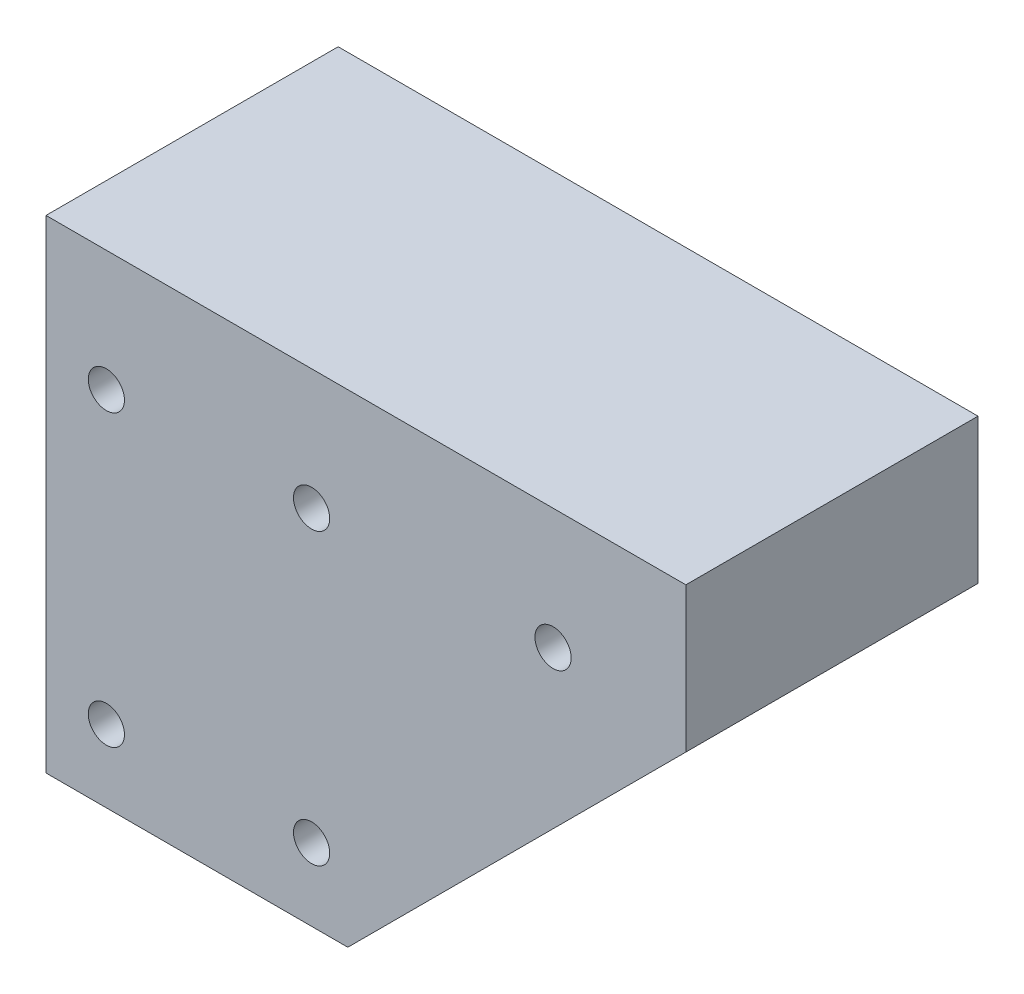
ISO-10303-21;
HEADER;
FILE_DESCRIPTION(('STEP AP214'),'2;1');
FILE_NAME('part.step','',(''),(''),'','','');
FILE_SCHEMA(('AUTOMOTIVE_DESIGN { 1 0 10303 214 1 1 1 1 }'));
ENDSEC;
DATA;
#1=APPLICATION_CONTEXT('core data for automotive mechanical design processes');
#2=APPLICATION_PROTOCOL_DEFINITION('international standard','automotive_design',2000,#1);
#3=PRODUCT_CONTEXT('',#1,'mechanical');
#4=PRODUCT('Part','Part','',(#3));
#5=PRODUCT_RELATED_PRODUCT_CATEGORY('part','',(#4));
#6=PRODUCT_DEFINITION_FORMATION('','',#4);
#7=PRODUCT_DEFINITION_CONTEXT('part definition',#1,'design');
#8=PRODUCT_DEFINITION('design','',#6,#7);
#9=PRODUCT_DEFINITION_SHAPE('','',#8);
#10=(LENGTH_UNIT() NAMED_UNIT(*) SI_UNIT(.MILLI.,.METRE.));
#11=(NAMED_UNIT(*) PLANE_ANGLE_UNIT() SI_UNIT($,.RADIAN.));
#12=(NAMED_UNIT(*) SI_UNIT($,.STERADIAN.) SOLID_ANGLE_UNIT());
#13=UNCERTAINTY_MEASURE_WITH_UNIT(LENGTH_MEASURE(1.E-05),#10,'distance_accuracy_value','');
#14=(GEOMETRIC_REPRESENTATION_CONTEXT(3) GLOBAL_UNCERTAINTY_ASSIGNED_CONTEXT((#13)) GLOBAL_UNIT_ASSIGNED_CONTEXT((#10,
#11,#12)) REPRESENTATION_CONTEXT('',''));
#15=CARTESIAN_POINT('',(0.,0.,0.));
#16=DIRECTION('',(0.,0.,1.));
#17=DIRECTION('',(1.,0.,0.));
#18=AXIS2_PLACEMENT_3D('',#15,#16,#17);
#19=CARTESIAN_POINT('',(53.,0.,24.2));
#20=DIRECTION('',(-1.,0.,0.));
#21=DIRECTION('',(0.,0.,1.));
#22=AXIS2_PLACEMENT_3D('',#19,#20,#21);
#23=PLANE('',#22);
#24=DIRECTION('',(0.,0.,1.));
#25=VECTOR('',#24,1.);
#26=CARTESIAN_POINT('',(53.,28.,0.));
#27=LINE('',#26,#25);
#28=CARTESIAN_POINT('',(53.,28.,0.));
#29=VERTEX_POINT('',#28);
#30=CARTESIAN_POINT('',(53.,28.,24.2));
#31=VERTEX_POINT('',#30);
#32=EDGE_CURVE('E97',#29,#31,#27,.T.);
#33=ORIENTED_EDGE('',*,*,#32,.F.);
#34=DIRECTION('',(0.,1.,0.));
#35=VECTOR('',#34,1.);
#36=CARTESIAN_POINT('',(53.,0.,0.));
#37=LINE('',#36,#35);
#38=CARTESIAN_POINT('',(53.,40.,0.));
#39=VERTEX_POINT('',#38);
#40=EDGE_CURVE('E110',#29,#39,#37,.T.);
#41=ORIENTED_EDGE('',*,*,#40,.T.);
#42=DIRECTION('',(0.,0.,-1.));
#43=VECTOR('',#42,1.);
#44=CARTESIAN_POINT('',(53.,40.,24.2));
#45=LINE('',#44,#43);
#46=CARTESIAN_POINT('',(53.,40.,24.2));
#47=VERTEX_POINT('',#46);
#48=EDGE_CURVE('E47',#47,#39,#45,.T.);
#49=ORIENTED_EDGE('',*,*,#48,.F.);
#50=DIRECTION('',(0.,1.,0.));
#51=VECTOR('',#50,1.);
#52=CARTESIAN_POINT('',(53.,0.,24.2));
#53=LINE('',#52,#51);
#54=EDGE_CURVE('E108',#31,#47,#53,.T.);
#55=ORIENTED_EDGE('',*,*,#54,.F.);
#56=EDGE_LOOP('',(#33,#41,#49,#55));
#57=FACE_BOUND('',#56,.T.);
#58=ADVANCED_FACE('F41',(#57),#23,.F.);
#59=CARTESIAN_POINT('',(0.,0.,24.2));
#60=DIRECTION('',(0.,0.,-1.));
#61=DIRECTION('',(-1.,0.,0.));
#62=AXIS2_PLACEMENT_3D('',#59,#60,#61);
#63=PLANE('',#62);
#64=CARTESIAN_POINT('',(5.,6.,24.2));
#65=DIRECTION('',(0.,0.,1.));
#66=DIRECTION('',(1.,0.,0.));
#67=AXIS2_PLACEMENT_3D('',#64,#65,#66);
#68=CIRCLE('',#67,1.5);
#69=CARTESIAN_POINT('',(6.5,6.,24.2));
#70=VERTEX_POINT('',#69);
#71=EDGE_CURVE('E195',#70,#70,#68,.T.);
#72=ORIENTED_EDGE('',*,*,#71,.F.);
#73=EDGE_LOOP('',(#72));
#74=FACE_BOUND('',#73,.T.);
#75=CARTESIAN_POINT('',(22.,30.,24.2));
#76=DIRECTION('',(0.,0.,1.));
#77=DIRECTION('',(1.,0.,0.));
#78=AXIS2_PLACEMENT_3D('',#75,#76,#77);
#79=CIRCLE('',#78,1.5);
#80=CARTESIAN_POINT('',(23.5,30.,24.2));
#81=VERTEX_POINT('',#80);
#82=EDGE_CURVE('E185',#81,#81,#79,.T.);
#83=ORIENTED_EDGE('',*,*,#82,.F.);
#84=EDGE_LOOP('',(#83));
#85=FACE_BOUND('',#84,.T.);
#86=CARTESIAN_POINT('',(22.,6.,24.2));
#87=DIRECTION('',(0.,0.,1.));
#88=DIRECTION('',(1.,0.,0.));
#89=AXIS2_PLACEMENT_3D('',#86,#87,#88);
#90=CIRCLE('',#89,1.5);
#91=CARTESIAN_POINT('',(23.5,6.,24.2));
#92=VERTEX_POINT('',#91);
#93=EDGE_CURVE('E180',#92,#92,#90,.T.);
#94=ORIENTED_EDGE('',*,*,#93,.F.);
#95=EDGE_LOOP('',(#94));
#96=FACE_BOUND('',#95,.T.);
#97=CARTESIAN_POINT('',(42.,30.,24.2));
#98=DIRECTION('',(0.,0.,1.));
#99=DIRECTION('',(1.,0.,0.));
#100=AXIS2_PLACEMENT_3D('',#97,#98,#99);
#101=CIRCLE('',#100,1.5);
#102=CARTESIAN_POINT('',(43.5,30.,24.2));
#103=VERTEX_POINT('',#102);
#104=EDGE_CURVE('E183',#103,#103,#101,.T.);
#105=ORIENTED_EDGE('',*,*,#104,.F.);
#106=EDGE_LOOP('',(#105));
#107=FACE_BOUND('',#106,.T.);
#108=CARTESIAN_POINT('',(5.,30.,24.2));
#109=DIRECTION('',(0.,0.,1.));
#110=DIRECTION('',(1.,0.,0.));
#111=AXIS2_PLACEMENT_3D('',#108,#109,#110);
#112=CIRCLE('',#111,1.5);
#113=CARTESIAN_POINT('',(6.5,30.,24.2));
#114=VERTEX_POINT('',#113);
#115=EDGE_CURVE('E193',#114,#114,#112,.T.);
#116=ORIENTED_EDGE('',*,*,#115,.F.);
#117=EDGE_LOOP('',(#116));
#118=FACE_BOUND('',#117,.T.);
#119=DIRECTION('',(-0.707106781186547,-0.707106781186547,0.));
#120=VECTOR('',#119,1.);
#121=CARTESIAN_POINT('',(25.,0.,24.2));
#122=LINE('',#121,#120);
#123=CARTESIAN_POINT('',(25.,0.,24.2));
#124=VERTEX_POINT('',#123);
#125=EDGE_CURVE('E105',#31,#124,#122,.T.);
#126=ORIENTED_EDGE('',*,*,#125,.F.);
#127=ORIENTED_EDGE('',*,*,#54,.T.);
#128=DIRECTION('',(-1.,0.,0.));
#129=VECTOR('',#128,1.);
#130=CARTESIAN_POINT('',(0.,40.,24.2));
#131=LINE('',#130,#129);
#132=CARTESIAN_POINT('',(0.,40.,24.2));
#133=VERTEX_POINT('',#132);
#134=EDGE_CURVE('E63',#47,#133,#131,.T.);
#135=ORIENTED_EDGE('',*,*,#134,.T.);
#136=DIRECTION('',(0.,-1.,0.));
#137=VECTOR('',#136,1.);
#138=CARTESIAN_POINT('',(0.,0.,24.2));
#139=LINE('',#138,#137);
#140=CARTESIAN_POINT('',(0.,0.,24.2));
#141=VERTEX_POINT('',#140);
#142=EDGE_CURVE('E114',#133,#141,#139,.T.);
#143=ORIENTED_EDGE('',*,*,#142,.T.);
#144=DIRECTION('',(1.,0.,0.));
#145=VECTOR('',#144,1.);
#146=CARTESIAN_POINT('',(0.,0.,24.2));
#147=LINE('',#146,#145);
#148=EDGE_CURVE('E86',#141,#124,#147,.T.);
#149=ORIENTED_EDGE('',*,*,#148,.T.);
#150=EDGE_LOOP('',(#126,#127,#135,#143,#149));
#151=FACE_BOUND('',#150,.T.);
#152=ADVANCED_FACE('F136',(#74,#85,#96,#107,#118,#151),#63,.F.);
#153=CARTESIAN_POINT('',(0.,0.,0.));
#154=DIRECTION('',(0.,0.,-1.));
#155=DIRECTION('',(-1.,0.,0.));
#156=AXIS2_PLACEMENT_3D('',#153,#154,#155);
#157=PLANE('',#156);
#158=CARTESIAN_POINT('',(5.,6.,0.));
#159=DIRECTION('',(0.,0.,1.));
#160=DIRECTION('',(1.,0.,0.));
#161=AXIS2_PLACEMENT_3D('',#158,#159,#160);
#162=CIRCLE('',#161,1.5);
#163=CARTESIAN_POINT('',(6.5,6.,0.));
#164=VERTEX_POINT('',#163);
#165=EDGE_CURVE('E199',#164,#164,#162,.T.);
#166=ORIENTED_EDGE('',*,*,#165,.T.);
#167=EDGE_LOOP('',(#166));
#168=FACE_BOUND('',#167,.T.);
#169=CARTESIAN_POINT('',(22.,30.,0.));
#170=DIRECTION('',(0.,0.,1.));
#171=DIRECTION('',(1.,0.,0.));
#172=AXIS2_PLACEMENT_3D('',#169,#170,#171);
#173=CIRCLE('',#172,1.5);
#174=CARTESIAN_POINT('',(23.5,30.,0.));
#175=VERTEX_POINT('',#174);
#176=EDGE_CURVE('E177',#175,#175,#173,.T.);
#177=ORIENTED_EDGE('',*,*,#176,.T.);
#178=EDGE_LOOP('',(#177));
#179=FACE_BOUND('',#178,.T.);
#180=CARTESIAN_POINT('',(22.,6.,0.));
#181=DIRECTION('',(0.,0.,1.));
#182=DIRECTION('',(1.,0.,0.));
#183=AXIS2_PLACEMENT_3D('',#180,#181,#182);
#184=CIRCLE('',#183,1.5);
#185=CARTESIAN_POINT('',(23.5,6.,0.));
#186=VERTEX_POINT('',#185);
#187=EDGE_CURVE('E172',#186,#186,#184,.T.);
#188=ORIENTED_EDGE('',*,*,#187,.T.);
#189=EDGE_LOOP('',(#188));
#190=FACE_BOUND('',#189,.T.);
#191=CARTESIAN_POINT('',(42.,30.,0.));
#192=DIRECTION('',(0.,0.,1.));
#193=DIRECTION('',(1.,0.,0.));
#194=AXIS2_PLACEMENT_3D('',#191,#192,#193);
#195=CIRCLE('',#194,1.5);
#196=CARTESIAN_POINT('',(43.5,30.,0.));
#197=VERTEX_POINT('',#196);
#198=EDGE_CURVE('E186',#197,#197,#195,.T.);
#199=ORIENTED_EDGE('',*,*,#198,.T.);
#200=EDGE_LOOP('',(#199));
#201=FACE_BOUND('',#200,.T.);
#202=CARTESIAN_POINT('',(5.,30.,0.));
#203=DIRECTION('',(0.,0.,1.));
#204=DIRECTION('',(1.,0.,0.));
#205=AXIS2_PLACEMENT_3D('',#202,#203,#204);
#206=CIRCLE('',#205,1.5);
#207=CARTESIAN_POINT('',(6.5,30.,0.));
#208=VERTEX_POINT('',#207);
#209=EDGE_CURVE('E202',#208,#208,#206,.T.);
#210=ORIENTED_EDGE('',*,*,#209,.T.);
#211=EDGE_LOOP('',(#210));
#212=FACE_BOUND('',#211,.T.);
#213=ORIENTED_EDGE('',*,*,#40,.F.);
#214=DIRECTION('',(-0.707106781186547,-0.707106781186547,0.));
#215=VECTOR('',#214,1.);
#216=CARTESIAN_POINT('',(25.,0.,0.));
#217=LINE('',#216,#215);
#218=CARTESIAN_POINT('',(25.,0.,0.));
#219=VERTEX_POINT('',#218);
#220=EDGE_CURVE('E91',#29,#219,#217,.T.);
#221=ORIENTED_EDGE('',*,*,#220,.T.);
#222=DIRECTION('',(1.,0.,0.));
#223=VECTOR('',#222,1.);
#224=CARTESIAN_POINT('',(0.,0.,0.));
#225=LINE('',#224,#223);
#226=CARTESIAN_POINT('',(0.,0.,0.));
#227=VERTEX_POINT('',#226);
#228=EDGE_CURVE('E113',#227,#219,#225,.T.);
#229=ORIENTED_EDGE('',*,*,#228,.F.);
#230=DIRECTION('',(0.,-1.,0.));
#231=VECTOR('',#230,1.);
#232=CARTESIAN_POINT('',(0.,0.,0.));
#233=LINE('',#232,#231);
#234=CARTESIAN_POINT('',(0.,40.,0.));
#235=VERTEX_POINT('',#234);
#236=EDGE_CURVE('E107',#235,#227,#233,.T.);
#237=ORIENTED_EDGE('',*,*,#236,.F.);
#238=DIRECTION('',(-1.,0.,0.));
#239=VECTOR('',#238,1.);
#240=CARTESIAN_POINT('',(0.,40.,0.));
#241=LINE('',#240,#239);
#242=EDGE_CURVE('E85',#39,#235,#241,.T.);
#243=ORIENTED_EDGE('',*,*,#242,.F.);
#244=EDGE_LOOP('',(#213,#221,#229,#237,#243));
#245=FACE_BOUND('',#244,.T.);
#246=ADVANCED_FACE('F111',(#168,#179,#190,#201,#212,#245),#157,.T.);
#247=CARTESIAN_POINT('',(0.,0.,24.2));
#248=DIRECTION('',(1.,0.,0.));
#249=DIRECTION('',(0.,0.,-1.));
#250=AXIS2_PLACEMENT_3D('',#247,#248,#249);
#251=PLANE('',#250);
#252=ORIENTED_EDGE('',*,*,#236,.T.);
#253=DIRECTION('',(0.,0.,-1.));
#254=VECTOR('',#253,1.);
#255=CARTESIAN_POINT('',(0.,0.,24.2));
#256=LINE('',#255,#254);
#257=EDGE_CURVE('E11',#141,#227,#256,.T.);
#258=ORIENTED_EDGE('',*,*,#257,.F.);
#259=ORIENTED_EDGE('',*,*,#142,.F.);
#260=DIRECTION('',(0.,0.,-1.));
#261=VECTOR('',#260,1.);
#262=CARTESIAN_POINT('',(0.,40.,24.2));
#263=LINE('',#262,#261);
#264=EDGE_CURVE('E119',#133,#235,#263,.T.);
#265=ORIENTED_EDGE('',*,*,#264,.T.);
#266=EDGE_LOOP('',(#252,#258,#259,#265));
#267=FACE_BOUND('',#266,.T.);
#268=ADVANCED_FACE('F43',(#267),#251,.F.);
#269=CARTESIAN_POINT('',(0.,0.,24.2));
#270=DIRECTION('',(0.,1.,0.));
#271=DIRECTION('',(0.,0.,1.));
#272=AXIS2_PLACEMENT_3D('',#269,#270,#271);
#273=PLANE('',#272);
#274=ORIENTED_EDGE('',*,*,#228,.T.);
#275=DIRECTION('',(0.,0.,1.));
#276=VECTOR('',#275,1.);
#277=CARTESIAN_POINT('',(25.,0.,0.));
#278=LINE('',#277,#276);
#279=EDGE_CURVE('E57',#219,#124,#278,.T.);
#280=ORIENTED_EDGE('',*,*,#279,.T.);
#281=ORIENTED_EDGE('',*,*,#148,.F.);
#282=ORIENTED_EDGE('',*,*,#257,.T.);
#283=EDGE_LOOP('',(#274,#280,#281,#282));
#284=FACE_BOUND('',#283,.T.);
#285=ADVANCED_FACE('F126',(#284),#273,.F.);
#286=CARTESIAN_POINT('',(0.,40.,24.2));
#287=DIRECTION('',(0.,-1.,0.));
#288=DIRECTION('',(0.,0.,-1.));
#289=AXIS2_PLACEMENT_3D('',#286,#287,#288);
#290=PLANE('',#289);
#291=ORIENTED_EDGE('',*,*,#242,.T.);
#292=ORIENTED_EDGE('',*,*,#264,.F.);
#293=ORIENTED_EDGE('',*,*,#134,.F.);
#294=ORIENTED_EDGE('',*,*,#48,.T.);
#295=EDGE_LOOP('',(#291,#292,#293,#294));
#296=FACE_BOUND('',#295,.T.);
#297=ADVANCED_FACE('F122',(#296),#290,.F.);
#298=CARTESIAN_POINT('',(25.,0.,0.));
#299=DIRECTION('',(-0.707106781186548,0.707106781186547,0.));
#300=DIRECTION('',(-0.707106781186547,-0.707106781186548,0.));
#301=AXIS2_PLACEMENT_3D('',#298,#299,#300);
#302=PLANE('',#301);
#303=ORIENTED_EDGE('',*,*,#125,.T.);
#304=ORIENTED_EDGE('',*,*,#279,.F.);
#305=ORIENTED_EDGE('',*,*,#220,.F.);
#306=ORIENTED_EDGE('',*,*,#32,.T.);
#307=EDGE_LOOP('',(#303,#304,#305,#306));
#308=FACE_BOUND('',#307,.T.);
#309=ADVANCED_FACE('F98',(#308),#302,.F.);
#310=CARTESIAN_POINT('',(5.,30.,0.));
#311=DIRECTION('',(0.,0.,1.));
#312=DIRECTION('',(1.,0.,0.));
#313=AXIS2_PLACEMENT_3D('',#310,#311,#312);
#314=CYLINDRICAL_SURFACE('',#313,1.5);
#315=ORIENTED_EDGE('',*,*,#209,.F.);
#316=EDGE_LOOP('',(#315));
#317=FACE_BOUND('',#316,.T.);
#318=ORIENTED_EDGE('',*,*,#115,.T.);
#319=EDGE_LOOP('',(#318));
#320=FACE_BOUND('',#319,.T.);
#321=ADVANCED_FACE('F148',(#317,#320),#314,.F.);
#322=CARTESIAN_POINT('',(42.,30.,0.));
#323=DIRECTION('',(0.,0.,1.));
#324=DIRECTION('',(1.,0.,0.));
#325=AXIS2_PLACEMENT_3D('',#322,#323,#324);
#326=CYLINDRICAL_SURFACE('',#325,1.5);
#327=ORIENTED_EDGE('',*,*,#198,.F.);
#328=EDGE_LOOP('',(#327));
#329=FACE_BOUND('',#328,.T.);
#330=ORIENTED_EDGE('',*,*,#104,.T.);
#331=EDGE_LOOP('',(#330));
#332=FACE_BOUND('',#331,.T.);
#333=ADVANCED_FACE('F155',(#329,#332),#326,.F.);
#334=CARTESIAN_POINT('',(22.,6.,0.));
#335=DIRECTION('',(0.,0.,1.));
#336=DIRECTION('',(1.,0.,0.));
#337=AXIS2_PLACEMENT_3D('',#334,#335,#336);
#338=CYLINDRICAL_SURFACE('',#337,1.5);
#339=ORIENTED_EDGE('',*,*,#187,.F.);
#340=EDGE_LOOP('',(#339));
#341=FACE_BOUND('',#340,.T.);
#342=ORIENTED_EDGE('',*,*,#93,.T.);
#343=EDGE_LOOP('',(#342));
#344=FACE_BOUND('',#343,.T.);
#345=ADVANCED_FACE('F156',(#341,#344),#338,.F.);
#346=CARTESIAN_POINT('',(22.,30.,0.));
#347=DIRECTION('',(0.,0.,1.));
#348=DIRECTION('',(1.,0.,0.));
#349=AXIS2_PLACEMENT_3D('',#346,#347,#348);
#350=CYLINDRICAL_SURFACE('',#349,1.5);
#351=ORIENTED_EDGE('',*,*,#176,.F.);
#352=EDGE_LOOP('',(#351));
#353=FACE_BOUND('',#352,.T.);
#354=ORIENTED_EDGE('',*,*,#82,.T.);
#355=EDGE_LOOP('',(#354));
#356=FACE_BOUND('',#355,.T.);
#357=ADVANCED_FACE('F152',(#353,#356),#350,.F.);
#358=CARTESIAN_POINT('',(5.,6.,0.));
#359=DIRECTION('',(0.,0.,1.));
#360=DIRECTION('',(1.,0.,0.));
#361=AXIS2_PLACEMENT_3D('',#358,#359,#360);
#362=CYLINDRICAL_SURFACE('',#361,1.5);
#363=ORIENTED_EDGE('',*,*,#165,.F.);
#364=EDGE_LOOP('',(#363));
#365=FACE_BOUND('',#364,.T.);
#366=ORIENTED_EDGE('',*,*,#71,.T.);
#367=EDGE_LOOP('',(#366));
#368=FACE_BOUND('',#367,.T.);
#369=ADVANCED_FACE('F160',(#365,#368),#362,.F.);
#370=CLOSED_SHELL('',(#58,#152,#246,#268,#285,#297,#309,#321,#333,#345,#357,#369));
#371=MANIFOLD_SOLID_BREP('B2',#370);
#372=ADVANCED_BREP_SHAPE_REPRESENTATION('',(#18,#371),#14);
#373=SHAPE_DEFINITION_REPRESENTATION(#9,#372);
ENDSEC;
END-ISO-10303-21;
